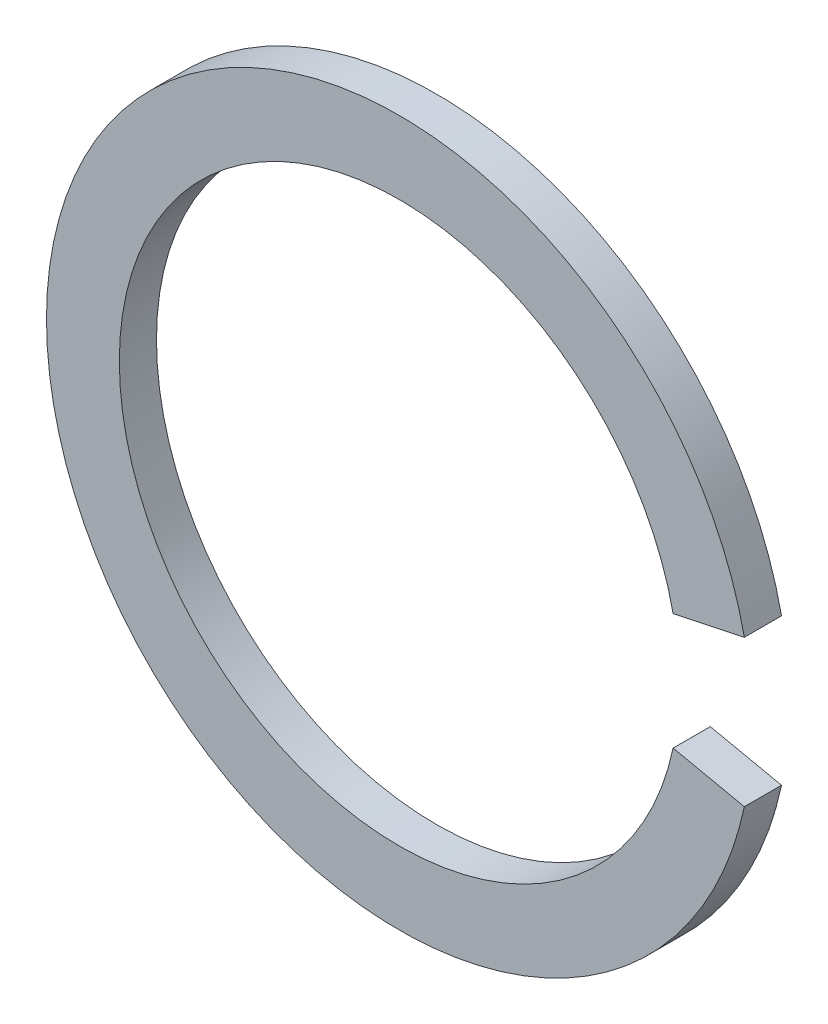
ISO-10303-21;
HEADER;
FILE_DESCRIPTION(('STEP AP214'),'2;1');
FILE_NAME('part.step','',(''),(''),'','','');
FILE_SCHEMA(('AUTOMOTIVE_DESIGN { 1 0 10303 214 1 1 1 1 }'));
ENDSEC;
DATA;
#1=APPLICATION_CONTEXT('core data for automotive mechanical design processes');
#2=APPLICATION_PROTOCOL_DEFINITION('international standard','automotive_design',2000,#1);
#3=PRODUCT_CONTEXT('',#1,'mechanical');
#4=PRODUCT('Part','Part','',(#3));
#5=PRODUCT_RELATED_PRODUCT_CATEGORY('part','',(#4));
#6=PRODUCT_DEFINITION_FORMATION('','',#4);
#7=PRODUCT_DEFINITION_CONTEXT('part definition',#1,'design');
#8=PRODUCT_DEFINITION('design','',#6,#7);
#9=PRODUCT_DEFINITION_SHAPE('','',#8);
#10=(LENGTH_UNIT() NAMED_UNIT(*) SI_UNIT(.MILLI.,.METRE.));
#11=(NAMED_UNIT(*) PLANE_ANGLE_UNIT() SI_UNIT($,.RADIAN.));
#12=(NAMED_UNIT(*) SI_UNIT($,.STERADIAN.) SOLID_ANGLE_UNIT());
#13=UNCERTAINTY_MEASURE_WITH_UNIT(LENGTH_MEASURE(1.E-05),#10,'distance_accuracy_value','');
#14=(GEOMETRIC_REPRESENTATION_CONTEXT(3) GLOBAL_UNCERTAINTY_ASSIGNED_CONTEXT((#13)) GLOBAL_UNIT_ASSIGNED_CONTEXT((#10,
#11,#12)) REPRESENTATION_CONTEXT('',''));
#15=CARTESIAN_POINT('',(0.,0.,0.));
#16=DIRECTION('',(0.,0.,1.));
#17=DIRECTION('',(1.,0.,0.));
#18=AXIS2_PLACEMENT_3D('',#15,#16,#17);
#19=CARTESIAN_POINT('',(0.,0.,0.75));
#20=DIRECTION('',(0.,0.,-1.));
#21=DIRECTION('',(-1.,0.,0.));
#22=AXIS2_PLACEMENT_3D('',#19,#20,#21);
#23=CYLINDRICAL_SURFACE('',#22,5.65);
#24=CARTESIAN_POINT('',(0.,0.,0.));
#25=DIRECTION('',(0.,0.,-1.));
#26=DIRECTION('',(-1.,0.,0.));
#27=AXIS2_PLACEMENT_3D('',#24,#25,#26);
#28=CIRCLE('',#27,5.65);
#29=CARTESIAN_POINT('',(5.526533944146,-1.17470105312034,0.));
#30=VERTEX_POINT('',#29);
#31=CARTESIAN_POINT('',(5.526533944146,1.17470105312034,0.));
#32=VERTEX_POINT('',#31);
#33=EDGE_CURVE('E105',#30,#32,#28,.T.);
#34=ORIENTED_EDGE('',*,*,#33,.T.);
#35=DIRECTION('',(0.,0.,-1.));
#36=VECTOR('',#35,1.);
#37=CARTESIAN_POINT('',(5.526533944146,1.17470105312034,0.75));
#38=LINE('',#37,#36);
#39=CARTESIAN_POINT('',(5.526533944146,1.17470105312034,0.75));
#40=VERTEX_POINT('',#39);
#41=EDGE_CURVE('E11',#40,#32,#38,.T.);
#42=ORIENTED_EDGE('',*,*,#41,.F.);
#43=CARTESIAN_POINT('',(0.,0.,0.75));
#44=DIRECTION('',(0.,0.,-1.));
#45=DIRECTION('',(-1.,0.,0.));
#46=AXIS2_PLACEMENT_3D('',#43,#44,#45);
#47=CIRCLE('',#46,5.65);
#48=CARTESIAN_POINT('',(5.526533944146,-1.17470105312034,0.75));
#49=VERTEX_POINT('',#48);
#50=EDGE_CURVE('E89',#49,#40,#47,.T.);
#51=ORIENTED_EDGE('',*,*,#50,.F.);
#52=DIRECTION('',(0.,0.,-1.));
#53=VECTOR('',#52,1.);
#54=CARTESIAN_POINT('',(5.526533944146,-1.17470105312034,0.75));
#55=LINE('',#54,#53);
#56=EDGE_CURVE('E98',#49,#30,#55,.T.);
#57=ORIENTED_EDGE('',*,*,#56,.T.);
#58=EDGE_LOOP('',(#34,#42,#51,#57));
#59=FACE_BOUND('',#58,.T.);
#60=ADVANCED_FACE('F39',(#59),#23,.F.);
#61=CARTESIAN_POINT('',(5.526533944146,1.17470105312034,0.75));
#62=DIRECTION('',(-0.207911690817759,0.978147600733806,0.));
#63=DIRECTION('',(-0.978147600733806,-0.207911690817759,0.));
#64=AXIS2_PLACEMENT_3D('',#61,#62,#63);
#65=PLANE('',#64);
#66=DIRECTION('',(0.978147600733806,0.207911690817759,0.));
#67=VECTOR('',#66,1.);
#68=CARTESIAN_POINT('',(5.526533944146,1.17470105312034,0.));
#69=LINE('',#68,#67);
#70=CARTESIAN_POINT('',(6.9644109172247,1.48033123862245,0.));
#71=VERTEX_POINT('',#70);
#72=EDGE_CURVE('E94',#32,#71,#69,.T.);
#73=ORIENTED_EDGE('',*,*,#72,.T.);
#74=DIRECTION('',(0.,0.,-1.));
#75=VECTOR('',#74,1.);
#76=CARTESIAN_POINT('',(6.9644109172247,1.48033123862245,0.75));
#77=LINE('',#76,#75);
#78=CARTESIAN_POINT('',(6.9644109172247,1.48033123862245,0.75));
#79=VERTEX_POINT('',#78);
#80=EDGE_CURVE('E50',#79,#71,#77,.T.);
#81=ORIENTED_EDGE('',*,*,#80,.F.);
#82=DIRECTION('',(0.978147600733806,0.207911690817759,0.));
#83=VECTOR('',#82,1.);
#84=CARTESIAN_POINT('',(5.526533944146,1.17470105312034,0.75));
#85=LINE('',#84,#83);
#86=EDGE_CURVE('E84',#40,#79,#85,.T.);
#87=ORIENTED_EDGE('',*,*,#86,.F.);
#88=ORIENTED_EDGE('',*,*,#41,.T.);
#89=EDGE_LOOP('',(#73,#81,#87,#88));
#90=FACE_BOUND('',#89,.T.);
#91=ADVANCED_FACE('F91',(#90),#65,.F.);
#92=CARTESIAN_POINT('',(0.,0.,0.75));
#93=DIRECTION('',(0.,0.,-1.));
#94=DIRECTION('',(-1.,0.,0.));
#95=AXIS2_PLACEMENT_3D('',#92,#93,#94);
#96=CYLINDRICAL_SURFACE('',#95,7.12);
#97=CARTESIAN_POINT('',(0.,0.,0.));
#98=DIRECTION('',(0.,0.,1.));
#99=DIRECTION('',(1.,0.,0.));
#100=AXIS2_PLACEMENT_3D('',#97,#98,#99);
#101=CIRCLE('',#100,7.12);
#102=CARTESIAN_POINT('',(6.9644109172247,-1.48033123862245,0.));
#103=VERTEX_POINT('',#102);
#104=EDGE_CURVE('E75',#71,#103,#101,.T.);
#105=ORIENTED_EDGE('',*,*,#104,.T.);
#106=DIRECTION('',(0.,0.,-1.));
#107=VECTOR('',#106,1.);
#108=CARTESIAN_POINT('',(6.9644109172247,-1.48033123862245,0.75));
#109=LINE('',#108,#107);
#110=CARTESIAN_POINT('',(6.9644109172247,-1.48033123862245,0.75));
#111=VERTEX_POINT('',#110);
#112=EDGE_CURVE('E92',#111,#103,#109,.T.);
#113=ORIENTED_EDGE('',*,*,#112,.F.);
#114=CARTESIAN_POINT('',(0.,0.,0.75));
#115=DIRECTION('',(0.,0.,1.));
#116=DIRECTION('',(1.,0.,0.));
#117=AXIS2_PLACEMENT_3D('',#114,#115,#116);
#118=CIRCLE('',#117,7.12);
#119=EDGE_CURVE('E86',#79,#111,#118,.T.);
#120=ORIENTED_EDGE('',*,*,#119,.F.);
#121=ORIENTED_EDGE('',*,*,#80,.T.);
#122=EDGE_LOOP('',(#105,#113,#120,#121));
#123=FACE_BOUND('',#122,.T.);
#124=ADVANCED_FACE('F96',(#123),#96,.T.);
#125=CARTESIAN_POINT('',(6.9644109172247,-1.48033123862245,0.75));
#126=DIRECTION('',(-0.20791169081776,-0.978147600733805,0.));
#127=DIRECTION('',(0.978147600733806,-0.20791169081776,0.));
#128=AXIS2_PLACEMENT_3D('',#125,#126,#127);
#129=PLANE('',#128);
#130=DIRECTION('',(-0.978147600733806,0.20791169081776,0.));
#131=VECTOR('',#130,1.);
#132=CARTESIAN_POINT('',(6.9644109172247,-1.48033123862245,0.));
#133=LINE('',#132,#131);
#134=EDGE_CURVE('E79',#103,#30,#133,.T.);
#135=ORIENTED_EDGE('',*,*,#134,.T.);
#136=ORIENTED_EDGE('',*,*,#56,.F.);
#137=DIRECTION('',(-0.978147600733806,0.20791169081776,0.));
#138=VECTOR('',#137,1.);
#139=CARTESIAN_POINT('',(6.9644109172247,-1.48033123862245,0.75));
#140=LINE('',#139,#138);
#141=EDGE_CURVE('E54',#111,#49,#140,.T.);
#142=ORIENTED_EDGE('',*,*,#141,.F.);
#143=ORIENTED_EDGE('',*,*,#112,.T.);
#144=EDGE_LOOP('',(#135,#136,#142,#143));
#145=FACE_BOUND('',#144,.T.);
#146=ADVANCED_FACE('F108',(#145),#129,.F.);
#147=CARTESIAN_POINT('',(0.,0.,0.75));
#148=DIRECTION('',(0.,0.,-1.));
#149=DIRECTION('',(-1.,0.,0.));
#150=AXIS2_PLACEMENT_3D('',#147,#148,#149);
#151=PLANE('',#150);
#152=ORIENTED_EDGE('',*,*,#50,.T.);
#153=ORIENTED_EDGE('',*,*,#86,.T.);
#154=ORIENTED_EDGE('',*,*,#119,.T.);
#155=ORIENTED_EDGE('',*,*,#141,.T.);
#156=EDGE_LOOP('',(#152,#153,#154,#155));
#157=FACE_BOUND('',#156,.T.);
#158=ADVANCED_FACE('F88',(#157),#151,.F.);
#159=CARTESIAN_POINT('',(0.,0.,0.));
#160=DIRECTION('',(0.,0.,-1.));
#161=DIRECTION('',(-1.,0.,0.));
#162=AXIS2_PLACEMENT_3D('',#159,#160,#161);
#163=PLANE('',#162);
#164=ORIENTED_EDGE('',*,*,#33,.F.);
#165=ORIENTED_EDGE('',*,*,#134,.F.);
#166=ORIENTED_EDGE('',*,*,#104,.F.);
#167=ORIENTED_EDGE('',*,*,#72,.F.);
#168=EDGE_LOOP('',(#164,#165,#166,#167));
#169=FACE_BOUND('',#168,.T.);
#170=ADVANCED_FACE('F115',(#169),#163,.T.);
#171=CLOSED_SHELL('',(#60,#91,#124,#146,#158,#170));
#172=MANIFOLD_SOLID_BREP('B2',#171);
#173=ADVANCED_BREP_SHAPE_REPRESENTATION('',(#18,#172),#14);
#174=SHAPE_DEFINITION_REPRESENTATION(#9,#173);
ENDSEC;
END-ISO-10303-21;
